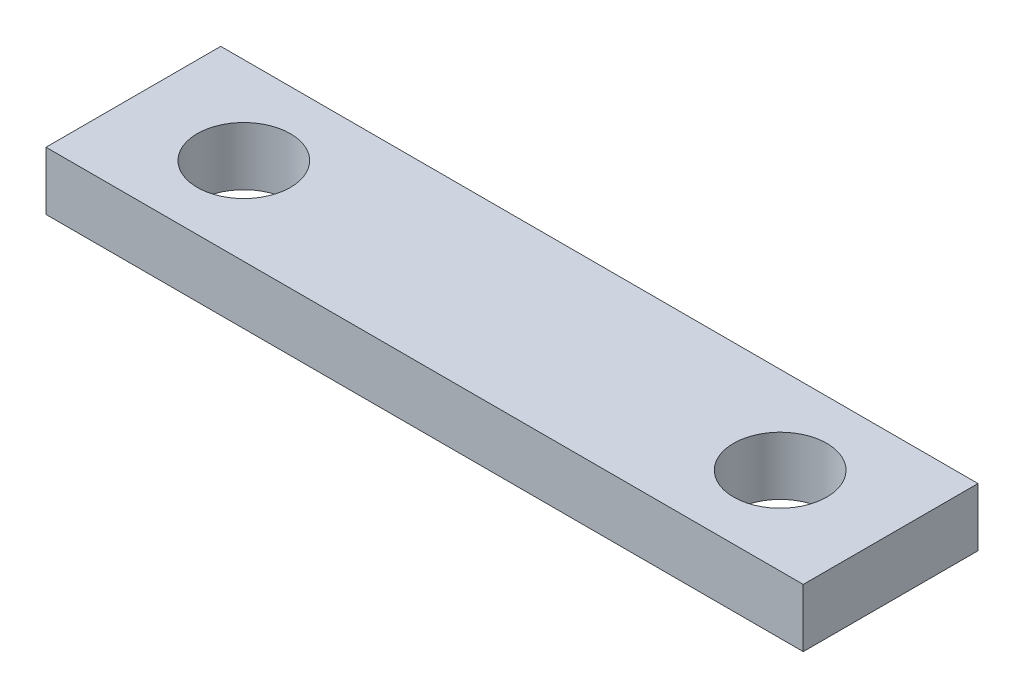
ISO-10303-21;
HEADER;
FILE_DESCRIPTION(('STEP AP214'),'2;1');
FILE_NAME('part.step','',(''),(''),'','','');
FILE_SCHEMA(('AUTOMOTIVE_DESIGN { 1 0 10303 214 1 1 1 1 }'));
ENDSEC;
DATA;
#1=APPLICATION_CONTEXT('core data for automotive mechanical design processes');
#2=APPLICATION_PROTOCOL_DEFINITION('international standard','automotive_design',2000,#1);
#3=PRODUCT_CONTEXT('',#1,'mechanical');
#4=PRODUCT('Part','Part','',(#3));
#5=PRODUCT_RELATED_PRODUCT_CATEGORY('part','',(#4));
#6=PRODUCT_DEFINITION_FORMATION('','',#4);
#7=PRODUCT_DEFINITION_CONTEXT('part definition',#1,'design');
#8=PRODUCT_DEFINITION('design','',#6,#7);
#9=PRODUCT_DEFINITION_SHAPE('','',#8);
#10=(LENGTH_UNIT() NAMED_UNIT(*) SI_UNIT(.MILLI.,.METRE.));
#11=(NAMED_UNIT(*) PLANE_ANGLE_UNIT() SI_UNIT($,.RADIAN.));
#12=(NAMED_UNIT(*) SI_UNIT($,.STERADIAN.) SOLID_ANGLE_UNIT());
#13=UNCERTAINTY_MEASURE_WITH_UNIT(LENGTH_MEASURE(1.E-05),#10,'distance_accuracy_value','');
#14=(GEOMETRIC_REPRESENTATION_CONTEXT(3) GLOBAL_UNCERTAINTY_ASSIGNED_CONTEXT((#13)) GLOBAL_UNIT_ASSIGNED_CONTEXT((#10,
#11,#12)) REPRESENTATION_CONTEXT('',''));
#15=CARTESIAN_POINT('',(0.,0.,0.));
#16=DIRECTION('',(0.,0.,1.));
#17=DIRECTION('',(1.,0.,0.));
#18=AXIS2_PLACEMENT_3D('',#15,#16,#17);
#19=CARTESIAN_POINT('',(0.,5.,0.));
#20=DIRECTION('',(0.,-1.,0.));
#21=DIRECTION('',(0.,0.,-1.));
#22=AXIS2_PLACEMENT_3D('',#19,#20,#21);
#23=PLANE('',#22);
#24=DIRECTION('',(0.,0.,-1.));
#25=VECTOR('',#24,1.);
#26=CARTESIAN_POINT('',(32.5,5.,7.5));
#27=LINE('',#26,#25);
#28=CARTESIAN_POINT('',(32.5,5.,7.5));
#29=VERTEX_POINT('',#28);
#30=CARTESIAN_POINT('',(32.5,5.,-7.5));
#31=VERTEX_POINT('',#30);
#32=EDGE_CURVE('E96',#29,#31,#27,.T.);
#33=ORIENTED_EDGE('',*,*,#32,.T.);
#34=DIRECTION('',(-1.,0.,0.));
#35=VECTOR('',#34,1.);
#36=CARTESIAN_POINT('',(-32.5,5.,-7.5));
#37=LINE('',#36,#35);
#38=CARTESIAN_POINT('',(-32.5,5.,-7.5));
#39=VERTEX_POINT('',#38);
#40=EDGE_CURVE('E91',#31,#39,#37,.T.);
#41=ORIENTED_EDGE('',*,*,#40,.T.);
#42=DIRECTION('',(0.,0.,1.));
#43=VECTOR('',#42,1.);
#44=CARTESIAN_POINT('',(-32.5,5.,7.5));
#45=LINE('',#44,#43);
#46=CARTESIAN_POINT('',(-32.5,5.,7.5));
#47=VERTEX_POINT('',#46);
#48=EDGE_CURVE('E94',#39,#47,#45,.T.);
#49=ORIENTED_EDGE('',*,*,#48,.T.);
#50=DIRECTION('',(1.,0.,0.));
#51=VECTOR('',#50,1.);
#52=CARTESIAN_POINT('',(-32.5,5.,7.5));
#53=LINE('',#52,#51);
#54=EDGE_CURVE('E61',#47,#29,#53,.T.);
#55=ORIENTED_EDGE('',*,*,#54,.T.);
#56=EDGE_LOOP('',(#33,#41,#49,#55));
#57=FACE_BOUND('',#56,.T.);
#58=CARTESIAN_POINT('',(23.02,5.,0.));
#59=DIRECTION('',(0.,1.,0.));
#60=DIRECTION('',(0.,0.,1.));
#61=AXIS2_PLACEMENT_3D('',#58,#59,#60);
#62=CIRCLE('',#61,4.);
#63=CARTESIAN_POINT('',(23.02,5.,4.));
#64=VERTEX_POINT('',#63);
#65=EDGE_CURVE('E116',#64,#64,#62,.T.);
#66=ORIENTED_EDGE('',*,*,#65,.F.);
#67=EDGE_LOOP('',(#66));
#68=FACE_BOUND('',#67,.T.);
#69=CARTESIAN_POINT('',(-23.02,5.,0.));
#70=DIRECTION('',(0.,1.,0.));
#71=DIRECTION('',(0.,0.,-1.));
#72=AXIS2_PLACEMENT_3D('',#69,#70,#71);
#73=CIRCLE('',#72,4.);
#74=CARTESIAN_POINT('',(-23.02,5.,-4.));
#75=VERTEX_POINT('',#74);
#76=EDGE_CURVE('E138',#75,#75,#73,.T.);
#77=ORIENTED_EDGE('',*,*,#76,.F.);
#78=EDGE_LOOP('',(#77));
#79=FACE_BOUND('',#78,.T.);
#80=ADVANCED_FACE('F43',(#57,#68,#79),#23,.F.);
#81=CARTESIAN_POINT('',(0.,0.,0.));
#82=DIRECTION('',(0.,-1.,0.));
#83=DIRECTION('',(0.,0.,-1.));
#84=AXIS2_PLACEMENT_3D('',#81,#82,#83);
#85=PLANE('',#84);
#86=CARTESIAN_POINT('',(23.02,0.,0.));
#87=DIRECTION('',(0.,1.,0.));
#88=DIRECTION('',(0.,0.,1.));
#89=AXIS2_PLACEMENT_3D('',#86,#87,#88);
#90=CIRCLE('',#89,4.);
#91=CARTESIAN_POINT('',(23.02,0.,4.));
#92=VERTEX_POINT('',#91);
#93=EDGE_CURVE('E134',#92,#92,#90,.T.);
#94=ORIENTED_EDGE('',*,*,#93,.T.);
#95=EDGE_LOOP('',(#94));
#96=FACE_BOUND('',#95,.T.);
#97=DIRECTION('',(0.,0.,-1.));
#98=VECTOR('',#97,1.);
#99=CARTESIAN_POINT('',(32.5,0.,7.5));
#100=LINE('',#99,#98);
#101=CARTESIAN_POINT('',(32.5,0.,7.5));
#102=VERTEX_POINT('',#101);
#103=CARTESIAN_POINT('',(32.5,0.,-7.5));
#104=VERTEX_POINT('',#103);
#105=EDGE_CURVE('E112',#102,#104,#100,.T.);
#106=ORIENTED_EDGE('',*,*,#105,.F.);
#107=DIRECTION('',(1.,0.,0.));
#108=VECTOR('',#107,1.);
#109=CARTESIAN_POINT('',(-32.5,0.,7.5));
#110=LINE('',#109,#108);
#111=CARTESIAN_POINT('',(-32.5,0.,7.5));
#112=VERTEX_POINT('',#111);
#113=EDGE_CURVE('E84',#112,#102,#110,.T.);
#114=ORIENTED_EDGE('',*,*,#113,.F.);
#115=DIRECTION('',(0.,0.,1.));
#116=VECTOR('',#115,1.);
#117=CARTESIAN_POINT('',(-32.5,0.,7.5));
#118=LINE('',#117,#116);
#119=CARTESIAN_POINT('',(-32.5,0.,-7.5));
#120=VERTEX_POINT('',#119);
#121=EDGE_CURVE('E78',#120,#112,#118,.T.);
#122=ORIENTED_EDGE('',*,*,#121,.F.);
#123=DIRECTION('',(-1.,0.,0.));
#124=VECTOR('',#123,1.);
#125=CARTESIAN_POINT('',(-32.5,0.,-7.5));
#126=LINE('',#125,#124);
#127=EDGE_CURVE('E101',#104,#120,#126,.T.);
#128=ORIENTED_EDGE('',*,*,#127,.F.);
#129=EDGE_LOOP('',(#106,#114,#122,#128));
#130=FACE_BOUND('',#129,.T.);
#131=CARTESIAN_POINT('',(-23.02,0.,0.));
#132=DIRECTION('',(0.,1.,0.));
#133=DIRECTION('',(0.,0.,-1.));
#134=AXIS2_PLACEMENT_3D('',#131,#132,#133);
#135=CIRCLE('',#134,4.);
#136=CARTESIAN_POINT('',(-23.02,0.,-4.));
#137=VERTEX_POINT('',#136);
#138=EDGE_CURVE('E142',#137,#137,#135,.T.);
#139=ORIENTED_EDGE('',*,*,#138,.T.);
#140=EDGE_LOOP('',(#139));
#141=FACE_BOUND('',#140,.T.);
#142=ADVANCED_FACE('F129',(#96,#130,#141),#85,.T.);
#143=CARTESIAN_POINT('',(32.5,5.,7.5));
#144=DIRECTION('',(-1.,0.,0.));
#145=DIRECTION('',(0.,0.,1.));
#146=AXIS2_PLACEMENT_3D('',#143,#144,#145);
#147=PLANE('',#146);
#148=ORIENTED_EDGE('',*,*,#105,.T.);
#149=DIRECTION('',(0.,-1.,0.));
#150=VECTOR('',#149,1.);
#151=CARTESIAN_POINT('',(32.5,5.,-7.5));
#152=LINE('',#151,#150);
#153=EDGE_CURVE('E11',#31,#104,#152,.T.);
#154=ORIENTED_EDGE('',*,*,#153,.F.);
#155=ORIENTED_EDGE('',*,*,#32,.F.);
#156=DIRECTION('',(0.,-1.,0.));
#157=VECTOR('',#156,1.);
#158=CARTESIAN_POINT('',(32.5,5.,7.5));
#159=LINE('',#158,#157);
#160=EDGE_CURVE('E108',#29,#102,#159,.T.);
#161=ORIENTED_EDGE('',*,*,#160,.T.);
#162=EDGE_LOOP('',(#148,#154,#155,#161));
#163=FACE_BOUND('',#162,.T.);
#164=ADVANCED_FACE('F45',(#163),#147,.F.);
#165=CARTESIAN_POINT('',(-32.5,5.,-7.5));
#166=DIRECTION('',(0.,0.,1.));
#167=DIRECTION('',(1.,0.,0.));
#168=AXIS2_PLACEMENT_3D('',#165,#166,#167);
#169=PLANE('',#168);
#170=ORIENTED_EDGE('',*,*,#127,.T.);
#171=DIRECTION('',(0.,-1.,0.));
#172=VECTOR('',#171,1.);
#173=CARTESIAN_POINT('',(-32.5,5.,-7.5));
#174=LINE('',#173,#172);
#175=EDGE_CURVE('E53',#39,#120,#174,.T.);
#176=ORIENTED_EDGE('',*,*,#175,.F.);
#177=ORIENTED_EDGE('',*,*,#40,.F.);
#178=ORIENTED_EDGE('',*,*,#153,.T.);
#179=EDGE_LOOP('',(#170,#176,#177,#178));
#180=FACE_BOUND('',#179,.T.);
#181=ADVANCED_FACE('F100',(#180),#169,.F.);
#182=CARTESIAN_POINT('',(-32.5,5.,7.5));
#183=DIRECTION('',(1.,0.,0.));
#184=DIRECTION('',(0.,0.,-1.));
#185=AXIS2_PLACEMENT_3D('',#182,#183,#184);
#186=PLANE('',#185);
#187=ORIENTED_EDGE('',*,*,#121,.T.);
#188=DIRECTION('',(0.,-1.,0.));
#189=VECTOR('',#188,1.);
#190=CARTESIAN_POINT('',(-32.5,5.,7.5));
#191=LINE('',#190,#189);
#192=EDGE_CURVE('E103',#47,#112,#191,.T.);
#193=ORIENTED_EDGE('',*,*,#192,.F.);
#194=ORIENTED_EDGE('',*,*,#48,.F.);
#195=ORIENTED_EDGE('',*,*,#175,.T.);
#196=EDGE_LOOP('',(#187,#193,#194,#195));
#197=FACE_BOUND('',#196,.T.);
#198=ADVANCED_FACE('F104',(#197),#186,.F.);
#199=CARTESIAN_POINT('',(-32.5,5.,7.5));
#200=DIRECTION('',(0.,0.,-1.));
#201=DIRECTION('',(-1.,0.,0.));
#202=AXIS2_PLACEMENT_3D('',#199,#200,#201);
#203=PLANE('',#202);
#204=ORIENTED_EDGE('',*,*,#113,.T.);
#205=ORIENTED_EDGE('',*,*,#160,.F.);
#206=ORIENTED_EDGE('',*,*,#54,.F.);
#207=ORIENTED_EDGE('',*,*,#192,.T.);
#208=EDGE_LOOP('',(#204,#205,#206,#207));
#209=FACE_BOUND('',#208,.T.);
#210=ADVANCED_FACE('F126',(#209),#203,.F.);
#211=CARTESIAN_POINT('',(23.02,5.,0.));
#212=DIRECTION('',(0.,-1.,0.));
#213=DIRECTION('',(0.,0.,-1.));
#214=AXIS2_PLACEMENT_3D('',#211,#212,#213);
#215=CYLINDRICAL_SURFACE('',#214,4.);
#216=ORIENTED_EDGE('',*,*,#65,.T.);
#217=EDGE_LOOP('',(#216));
#218=FACE_BOUND('',#217,.T.);
#219=ORIENTED_EDGE('',*,*,#93,.F.);
#220=EDGE_LOOP('',(#219));
#221=FACE_BOUND('',#220,.T.);
#222=ADVANCED_FACE('F161',(#218,#221),#215,.F.);
#223=CARTESIAN_POINT('',(-23.02,5.,0.));
#224=DIRECTION('',(0.,-1.,0.));
#225=DIRECTION('',(0.,0.,-1.));
#226=AXIS2_PLACEMENT_3D('',#223,#224,#225);
#227=CYLINDRICAL_SURFACE('',#226,4.);
#228=ORIENTED_EDGE('',*,*,#76,.T.);
#229=EDGE_LOOP('',(#228));
#230=FACE_BOUND('',#229,.T.);
#231=ORIENTED_EDGE('',*,*,#138,.F.);
#232=EDGE_LOOP('',(#231));
#233=FACE_BOUND('',#232,.T.);
#234=ADVANCED_FACE('F150',(#230,#233),#227,.F.);
#235=CLOSED_SHELL('',(#80,#142,#164,#181,#198,#210,#222,#234));
#236=MANIFOLD_SOLID_BREP('B2',#235);
#237=ADVANCED_BREP_SHAPE_REPRESENTATION('',(#18,#236),#14);
#238=SHAPE_DEFINITION_REPRESENTATION(#9,#237);
ENDSEC;
END-ISO-10303-21;
